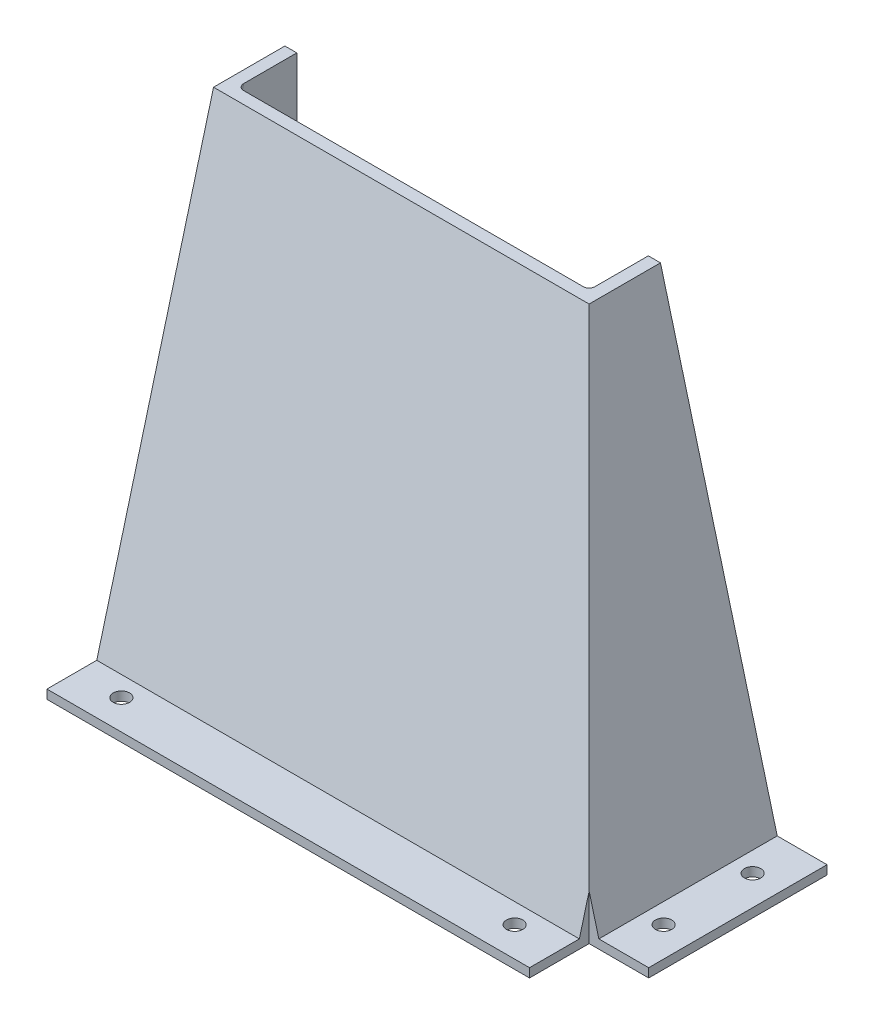
ISO-10303-21;
HEADER;
FILE_DESCRIPTION(('STEP AP214'),'2;1');
FILE_NAME('part.step','',(''),(''),'','','');
FILE_SCHEMA(('AUTOMOTIVE_DESIGN { 1 0 10303 214 1 1 1 1 }'));
ENDSEC;
DATA;
#1=APPLICATION_CONTEXT('core data for automotive mechanical design processes');
#2=APPLICATION_PROTOCOL_DEFINITION('international standard','automotive_design',2000,#1);
#3=PRODUCT_CONTEXT('',#1,'mechanical');
#4=PRODUCT('Part','Part','',(#3));
#5=PRODUCT_RELATED_PRODUCT_CATEGORY('part','',(#4));
#6=PRODUCT_DEFINITION_FORMATION('','',#4);
#7=PRODUCT_DEFINITION_CONTEXT('part definition',#1,'design');
#8=PRODUCT_DEFINITION('design','',#6,#7);
#9=PRODUCT_DEFINITION_SHAPE('','',#8);
#10=(LENGTH_UNIT() NAMED_UNIT(*) SI_UNIT(.MILLI.,.METRE.));
#11=(NAMED_UNIT(*) PLANE_ANGLE_UNIT() SI_UNIT($,.RADIAN.));
#12=(NAMED_UNIT(*) SI_UNIT($,.STERADIAN.) SOLID_ANGLE_UNIT());
#13=UNCERTAINTY_MEASURE_WITH_UNIT(LENGTH_MEASURE(1.E-05),#10,'distance_accuracy_value','');
#14=(GEOMETRIC_REPRESENTATION_CONTEXT(3) GLOBAL_UNCERTAINTY_ASSIGNED_CONTEXT((#13)) GLOBAL_UNIT_ASSIGNED_CONTEXT((#10,
#11,#12)) REPRESENTATION_CONTEXT('',''));
#15=CARTESIAN_POINT('',(0.,0.,0.));
#16=DIRECTION('',(0.,0.,1.));
#17=DIRECTION('',(1.,0.,0.));
#18=AXIS2_PLACEMENT_3D('',#15,#16,#17);
#19=CARTESIAN_POINT('',(77.9651100404987,150.0011,48.9051100404986));
#20=DIRECTION('',(-1.,0.,0.));
#21=DIRECTION('',(0.,0.,1.));
#22=AXIS2_PLACEMENT_3D('',#19,#20,#21);
#23=PLANE('',#22);
#24=DIRECTION('',(0.,-1.,0.));
#25=VECTOR('',#24,1.);
#26=CARTESIAN_POINT('',(77.9651100404987,150.0011,28.9051100404986));
#27=LINE('',#26,#25);
#28=CARTESIAN_POINT('',(77.9651100404987,15.26208734813,28.9051100404986));
#29=VERTEX_POINT('',#28);
#30=CARTESIAN_POINT('',(77.9651100404987,0.,28.9051100404986));
#31=VERTEX_POINT('',#30);
#32=EDGE_CURVE('E182',#29,#31,#27,.T.);
#33=ORIENTED_EDGE('',*,*,#32,.F.);
#34=DIRECTION('',(0.,0.966234939601246,-0.257662650560332));
#35=VECTOR('',#34,1.);
#36=CARTESIAN_POINT('',(77.9651100404985,140.241690871369,-4.42278423236517));
#37=LINE('',#36,#35);
#38=CARTESIAN_POINT('',(77.9651100404987,3.,32.175));
#39=VERTEX_POINT('',#38);
#40=EDGE_CURVE('E176',#39,#29,#37,.T.);
#41=ORIENTED_EDGE('',*,*,#40,.F.);
#42=DIRECTION('',(0.,0.,-1.));
#43=VECTOR('',#42,1.);
#44=CARTESIAN_POINT('',(77.9651100404987,3.,48.9051100404986));
#45=LINE('',#44,#43);
#46=CARTESIAN_POINT('',(77.9651100404987,3.,48.9051100404986));
#47=VERTEX_POINT('',#46);
#48=EDGE_CURVE('E179',#47,#39,#45,.T.);
#49=ORIENTED_EDGE('',*,*,#48,.F.);
#50=DIRECTION('',(0.,-1.,0.));
#51=VECTOR('',#50,1.);
#52=CARTESIAN_POINT('',(77.9651100404987,150.0011,48.9051100404986));
#53=LINE('',#52,#51);
#54=CARTESIAN_POINT('',(77.9651100404987,0.,48.9051100404986));
#55=VERTEX_POINT('',#54);
#56=EDGE_CURVE('E228',#47,#55,#53,.T.);
#57=ORIENTED_EDGE('',*,*,#56,.T.);
#58=DIRECTION('',(0.,0.,-1.));
#59=VECTOR('',#58,1.);
#60=CARTESIAN_POINT('',(77.9651100404987,0.,48.9051100404986));
#61=LINE('',#60,#59);
#62=EDGE_CURVE('E214',#55,#31,#61,.T.);
#63=ORIENTED_EDGE('',*,*,#62,.T.);
#64=EDGE_LOOP('',(#33,#41,#49,#57,#63));
#65=FACE_BOUND('',#64,.T.);
#66=ADVANCED_FACE('F49',(#65),#23,.F.);
#67=CARTESIAN_POINT('',(97.9651100404987,150.0011,28.9051100404987));
#68=DIRECTION('',(0.,0.,-1.));
#69=DIRECTION('',(-1.,0.,0.));
#70=AXIS2_PLACEMENT_3D('',#67,#68,#69);
#71=PLANE('',#70);
#72=DIRECTION('',(1.,0.,0.));
#73=VECTOR('',#72,1.);
#74=CARTESIAN_POINT('',(97.9651100404987,3.,28.9051100404987));
#75=LINE('',#74,#73);
#76=CARTESIAN_POINT('',(81.235,3.,28.9051100404986));
#77=VERTEX_POINT('',#76);
#78=CARTESIAN_POINT('',(97.9651100404987,3.,28.9051100404987));
#79=VERTEX_POINT('',#78);
#80=EDGE_CURVE('E209',#77,#79,#75,.T.);
#81=ORIENTED_EDGE('',*,*,#80,.F.);
#82=DIRECTION('',(0.257662650560332,-0.966234939601246,0.));
#83=VECTOR('',#82,1.);
#84=CARTESIAN_POINT('',(44.4201276375435,141.055771359212,28.9051100404987));
#85=LINE('',#84,#83);
#86=EDGE_CURVE('E189',#29,#77,#85,.T.);
#87=ORIENTED_EDGE('',*,*,#86,.F.);
#88=ORIENTED_EDGE('',*,*,#32,.T.);
#89=DIRECTION('',(1.,0.,0.));
#90=VECTOR('',#89,1.);
#91=CARTESIAN_POINT('',(97.9651100404987,0.,28.9051100404987));
#92=LINE('',#91,#90);
#93=CARTESIAN_POINT('',(97.9651100404987,0.,28.9051100404986));
#94=VERTEX_POINT('',#93);
#95=EDGE_CURVE('E225',#31,#94,#92,.T.);
#96=ORIENTED_EDGE('',*,*,#95,.T.);
#97=DIRECTION('',(0.,-1.,0.));
#98=VECTOR('',#97,1.);
#99=CARTESIAN_POINT('',(97.9651100404987,150.0011,28.9051100404987));
#100=LINE('',#99,#98);
#101=EDGE_CURVE('E229',#79,#94,#100,.T.);
#102=ORIENTED_EDGE('',*,*,#101,.F.);
#103=EDGE_LOOP('',(#81,#87,#88,#96,#102));
#104=FACE_BOUND('',#103,.T.);
#105=ADVANCED_FACE('F362',(#104),#71,.F.);
#106=CARTESIAN_POINT('',(0.,0.,0.));
#107=DIRECTION('',(0.,1.,0.));
#108=DIRECTION('',(0.,0.,1.));
#109=AXIS2_PLACEMENT_3D('',#106,#107,#108);
#110=PLANE('',#109);
#111=CARTESIAN_POINT('',(87.9651100404987,0.,-15.975));
#112=DIRECTION('',(0.,-1.,0.));
#113=DIRECTION('',(0.,0.,-1.));
#114=AXIS2_PLACEMENT_3D('',#111,#112,#113);
#115=CIRCLE('',#114,2.75000000000001);
#116=CARTESIAN_POINT('',(87.9651100404987,0.,-18.725));
#117=VERTEX_POINT('',#116);
#118=EDGE_CURVE('E280',#117,#117,#115,.T.);
#119=ORIENTED_EDGE('',*,*,#118,.F.);
#120=EDGE_LOOP('',(#119));
#121=FACE_BOUND('',#120,.T.);
#122=CARTESIAN_POINT('',(87.9651100404987,0.,13.9051100404987));
#123=DIRECTION('',(0.,-1.,0.));
#124=DIRECTION('',(0.,0.,-1.));
#125=AXIS2_PLACEMENT_3D('',#122,#123,#124);
#126=CIRCLE('',#125,2.75000000000001);
#127=CARTESIAN_POINT('',(87.9651100404987,0.,11.1551100404986));
#128=VERTEX_POINT('',#127);
#129=EDGE_CURVE('E328',#128,#128,#126,.T.);
#130=ORIENTED_EDGE('',*,*,#129,.F.);
#131=EDGE_LOOP('',(#130));
#132=FACE_BOUND('',#131,.T.);
#133=CARTESIAN_POINT('',(62.9651100404987,0.,38.9051100404986));
#134=DIRECTION('',(0.,-1.,0.));
#135=DIRECTION('',(0.,0.,-1.));
#136=AXIS2_PLACEMENT_3D('',#133,#134,#135);
#137=CIRCLE('',#136,2.75000000000001);
#138=CARTESIAN_POINT('',(62.9651100404987,0.,36.1551100404986));
#139=VERTEX_POINT('',#138);
#140=EDGE_CURVE('E322',#139,#139,#137,.T.);
#141=ORIENTED_EDGE('',*,*,#140,.F.);
#142=EDGE_LOOP('',(#141));
#143=FACE_BOUND('',#142,.T.);
#144=CARTESIAN_POINT('',(-69.035,0.,38.9051100404986));
#145=DIRECTION('',(0.,-1.,0.));
#146=DIRECTION('',(0.,0.,-1.));
#147=AXIS2_PLACEMENT_3D('',#144,#145,#146);
#148=CIRCLE('',#147,2.75000000000001);
#149=CARTESIAN_POINT('',(-69.035,0.,36.1551100404986));
#150=VERTEX_POINT('',#149);
#151=EDGE_CURVE('E315',#150,#150,#148,.T.);
#152=ORIENTED_EDGE('',*,*,#151,.F.);
#153=EDGE_LOOP('',(#152));
#154=FACE_BOUND('',#153,.T.);
#155=DIRECTION('',(0.,0.,1.));
#156=VECTOR('',#155,1.);
#157=CARTESIAN_POINT('',(-80.035,0.,28.9051100404986));
#158=LINE('',#157,#156);
#159=CARTESIAN_POINT('',(-80.035,0.,-30.975));
#160=VERTEX_POINT('',#159);
#161=CARTESIAN_POINT('',(-80.035,0.,26.8352200809973));
#162=VERTEX_POINT('',#161);
#163=EDGE_CURVE('E220',#160,#162,#158,.T.);
#164=ORIENTED_EDGE('',*,*,#163,.T.);
#165=CARTESIAN_POINT('',(-78.035,0.,26.8352200809973));
#166=DIRECTION('',(0.,1.,0.));
#167=DIRECTION('',(0.,0.,-1.));
#168=AXIS2_PLACEMENT_3D('',#165,#166,#167);
#169=ELLIPSE('',#168,2.06988995950134,2.);
#170=CARTESIAN_POINT('',(-78.035,0.,28.9051100404986));
#171=VERTEX_POINT('',#170);
#172=EDGE_CURVE('E60',#162,#171,#169,.T.);
#173=ORIENTED_EDGE('',*,*,#172,.T.);
#174=DIRECTION('',(1.,0.,0.));
#175=VECTOR('',#174,1.);
#176=CARTESIAN_POINT('',(0.,0.,28.9051100404986));
#177=LINE('',#176,#175);
#178=CARTESIAN_POINT('',(76.0326401612962,0.,28.9051100404986));
#179=VERTEX_POINT('',#178);
#180=EDGE_CURVE('E265',#171,#179,#177,.T.);
#181=ORIENTED_EDGE('',*,*,#180,.T.);
#182=CARTESIAN_POINT('',(75.8952200809973,0.,26.8352200809973));
#183=DIRECTION('',(0.,1.,0.));
#184=DIRECTION('',(-0.707106781186548,0.,-0.707106781186548));
#185=AXIS2_PLACEMENT_3D('',#182,#183,#184);
#186=ELLIPSE('',#185,2.13749593891752,2.);
#187=CARTESIAN_POINT('',(77.9651100404987,0.,26.9726401612962));
#188=VERTEX_POINT('',#187);
#189=EDGE_CURVE('E439',#179,#188,#186,.T.);
#190=ORIENTED_EDGE('',*,*,#189,.T.);
#191=DIRECTION('',(0.,0.,-1.));
#192=VECTOR('',#191,1.);
#193=CARTESIAN_POINT('',(77.9651100404987,0.,0.));
#194=LINE('',#193,#192);
#195=CARTESIAN_POINT('',(77.9651100404987,0.,-30.975));
#196=VERTEX_POINT('',#195);
#197=EDGE_CURVE('E71',#188,#196,#194,.T.);
#198=ORIENTED_EDGE('',*,*,#197,.T.);
#199=DIRECTION('',(-1.,0.,0.));
#200=VECTOR('',#199,1.);
#201=CARTESIAN_POINT('',(-80.035,0.,-30.975));
#202=LINE('',#201,#200);
#203=CARTESIAN_POINT('',(97.9651100404987,0.,-30.975));
#204=VERTEX_POINT('',#203);
#205=EDGE_CURVE('E375',#204,#196,#202,.T.);
#206=ORIENTED_EDGE('',*,*,#205,.F.);
#207=DIRECTION('',(0.,0.,-1.));
#208=VECTOR('',#207,1.);
#209=CARTESIAN_POINT('',(97.9651100404987,0.,69.1288584566553));
#210=LINE('',#209,#208);
#211=EDGE_CURVE('E244',#94,#204,#210,.T.);
#212=ORIENTED_EDGE('',*,*,#211,.F.);
#213=ORIENTED_EDGE('',*,*,#95,.F.);
#214=ORIENTED_EDGE('',*,*,#62,.F.);
#215=DIRECTION('',(-1.,0.,0.));
#216=VECTOR('',#215,1.);
#217=CARTESIAN_POINT('',(100.212107655599,0.,48.9051100404986));
#218=LINE('',#217,#216);
#219=CARTESIAN_POINT('',(-84.035,0.,48.9051100404986));
#220=VERTEX_POINT('',#219);
#221=EDGE_CURVE('E247',#55,#220,#218,.T.);
#222=ORIENTED_EDGE('',*,*,#221,.T.);
#223=DIRECTION('',(0.,0.,1.));
#224=VECTOR('',#223,1.);
#225=CARTESIAN_POINT('',(-84.035,0.,28.9051100404986));
#226=LINE('',#225,#224);
#227=CARTESIAN_POINT('',(-84.035,0.,-30.975));
#228=VERTEX_POINT('',#227);
#229=EDGE_CURVE('E285',#228,#220,#226,.T.);
#230=ORIENTED_EDGE('',*,*,#229,.F.);
#231=DIRECTION('',(1.,0.,0.));
#232=VECTOR('',#231,1.);
#233=CARTESIAN_POINT('',(-84.035,0.,-30.975));
#234=LINE('',#233,#232);
#235=EDGE_CURVE('E217',#228,#160,#234,.T.);
#236=ORIENTED_EDGE('',*,*,#235,.T.);
#237=EDGE_LOOP('',(#164,#173,#181,#190,#198,#206,#212,#213,#214,#222,#230,#236));
#238=FACE_BOUND('',#237,.T.);
#239=ADVANCED_FACE('F385',(#121,#132,#143,#154,#238),#110,.F.);
#240=CARTESIAN_POINT('',(100.212107655599,3.,28.9051100404986));
#241=DIRECTION('',(0.,1.,0.));
#242=DIRECTION('',(0.,0.,1.));
#243=AXIS2_PLACEMENT_3D('',#240,#241,#242);
#244=PLANE('',#243);
#245=DIRECTION('',(-1.,0.,0.));
#246=VECTOR('',#245,1.);
#247=CARTESIAN_POINT('',(214.966897072176,3.,32.175));
#248=LINE('',#247,#246);
#249=CARTESIAN_POINT('',(-84.035,3.,32.175));
#250=VERTEX_POINT('',#249);
#251=EDGE_CURVE('E192',#39,#250,#248,.T.);
#252=ORIENTED_EDGE('',*,*,#251,.T.);
#253=DIRECTION('',(0.,0.,-1.));
#254=VECTOR('',#253,1.);
#255=CARTESIAN_POINT('',(-84.035,3.,48.9051100404986));
#256=LINE('',#255,#254);
#257=CARTESIAN_POINT('',(-84.035,3.,48.9051100404986));
#258=VERTEX_POINT('',#257);
#259=EDGE_CURVE('E307',#258,#250,#256,.T.);
#260=ORIENTED_EDGE('',*,*,#259,.F.);
#261=DIRECTION('',(-1.,0.,0.));
#262=VECTOR('',#261,1.);
#263=CARTESIAN_POINT('',(100.212107655599,3.,48.9051100404986));
#264=LINE('',#263,#262);
#265=EDGE_CURVE('E207',#47,#258,#264,.T.);
#266=ORIENTED_EDGE('',*,*,#265,.F.);
#267=ORIENTED_EDGE('',*,*,#48,.T.);
#268=EDGE_LOOP('',(#252,#260,#266,#267));
#269=FACE_BOUND('',#268,.T.);
#270=CARTESIAN_POINT('',(62.9651100404987,3.,38.9051100404986));
#271=DIRECTION('',(0.,1.,0.));
#272=DIRECTION('',(0.,0.,1.));
#273=AXIS2_PLACEMENT_3D('',#270,#271,#272);
#274=CIRCLE('',#273,2.75000000000001);
#275=CARTESIAN_POINT('',(62.9651100404987,3.,41.6551100404987));
#276=VERTEX_POINT('',#275);
#277=EDGE_CURVE('E318',#276,#276,#274,.F.);
#278=ORIENTED_EDGE('',*,*,#277,.T.);
#279=EDGE_LOOP('',(#278));
#280=FACE_BOUND('',#279,.T.);
#281=CARTESIAN_POINT('',(-69.035,3.,38.9051100404986));
#282=DIRECTION('',(0.,1.,0.));
#283=DIRECTION('',(0.,0.,1.));
#284=AXIS2_PLACEMENT_3D('',#281,#282,#283);
#285=CIRCLE('',#284,2.75000000000001);
#286=CARTESIAN_POINT('',(-69.035,3.,41.6551100404987));
#287=VERTEX_POINT('',#286);
#288=EDGE_CURVE('E201',#287,#287,#285,.F.);
#289=ORIENTED_EDGE('',*,*,#288,.T.);
#290=EDGE_LOOP('',(#289));
#291=FACE_BOUND('',#290,.T.);
#292=ADVANCED_FACE('F205',(#269,#280,#291),#244,.T.);
#293=CARTESIAN_POINT('',(0.,150.,0.));
#294=DIRECTION('',(0.,-1.,0.));
#295=DIRECTION('',(0.,0.,-1.));
#296=AXIS2_PLACEMENT_3D('',#293,#294,#295);
#297=PLANE('',#296);
#298=DIRECTION('',(1.,0.,0.));
#299=VECTOR('',#298,1.);
#300=CARTESIAN_POINT('',(0.,150.,-11.0948899595014));
#301=LINE('',#300,#299);
#302=CARTESIAN_POINT('',(-78.035,150.,-11.0948899595014));
#303=VERTEX_POINT('',#302);
#304=CARTESIAN_POINT('',(36.0326401612962,150.,-11.0948899595014));
#305=VERTEX_POINT('',#304);
#306=EDGE_CURVE('E260',#303,#305,#301,.T.);
#307=ORIENTED_EDGE('',*,*,#306,.F.);
#308=CARTESIAN_POINT('',(-78.035,150.,-13.1647799190027));
#309=DIRECTION('',(0.,-1.,0.));
#310=DIRECTION('',(0.,0.,-1.));
#311=AXIS2_PLACEMENT_3D('',#308,#309,#310);
#312=ELLIPSE('',#311,2.06988995950134,2.);
#313=CARTESIAN_POINT('',(-80.035,150.,-13.1647799190027));
#314=VERTEX_POINT('',#313);
#315=EDGE_CURVE('E79',#303,#314,#312,.T.);
#316=ORIENTED_EDGE('',*,*,#315,.T.);
#317=DIRECTION('',(0.,0.,-1.));
#318=VECTOR('',#317,1.);
#319=CARTESIAN_POINT('',(-80.035,150.,-30.975));
#320=LINE('',#319,#318);
#321=CARTESIAN_POINT('',(-80.035,150.,-30.975));
#322=VERTEX_POINT('',#321);
#323=EDGE_CURVE('E276',#314,#322,#320,.T.);
#324=ORIENTED_EDGE('',*,*,#323,.T.);
#325=DIRECTION('',(1.,0.,0.));
#326=VECTOR('',#325,1.);
#327=CARTESIAN_POINT('',(-84.035,150.,-30.975));
#328=LINE('',#327,#326);
#329=CARTESIAN_POINT('',(-84.035,150.,-30.975));
#330=VERTEX_POINT('',#329);
#331=EDGE_CURVE('E210',#330,#322,#328,.T.);
#332=ORIENTED_EDGE('',*,*,#331,.F.);
#333=DIRECTION('',(0.,0.,-1.));
#334=VECTOR('',#333,1.);
#335=CARTESIAN_POINT('',(-84.035,150.,-9.02500000000001));
#336=LINE('',#335,#334);
#337=CARTESIAN_POINT('',(-84.035,150.,-7.02500000000002));
#338=VERTEX_POINT('',#337);
#339=EDGE_CURVE('E304',#338,#330,#336,.T.);
#340=ORIENTED_EDGE('',*,*,#339,.F.);
#341=DIRECTION('',(-1.,0.,0.));
#342=VECTOR('',#341,1.);
#343=CARTESIAN_POINT('',(214.966897072176,150.,-7.02500000000002));
#344=LINE('',#343,#342);
#345=CARTESIAN_POINT('',(42.035,150.,-7.02500000000003));
#346=VERTEX_POINT('',#345);
#347=EDGE_CURVE('E202',#346,#338,#344,.T.);
#348=ORIENTED_EDGE('',*,*,#347,.F.);
#349=DIRECTION('',(0.,0.,-1.));
#350=VECTOR('',#349,1.);
#351=CARTESIAN_POINT('',(42.035,150.,167.906897072176));
#352=LINE('',#351,#350);
#353=CARTESIAN_POINT('',(42.035,150.,-30.975));
#354=VERTEX_POINT('',#353);
#355=EDGE_CURVE('E341',#346,#354,#352,.T.);
#356=ORIENTED_EDGE('',*,*,#355,.T.);
#357=DIRECTION('',(1.,0.,0.));
#358=VECTOR('',#357,1.);
#359=CARTESIAN_POINT('',(42.035,150.,-30.975));
#360=LINE('',#359,#358);
#361=CARTESIAN_POINT('',(40.035,150.,-30.975));
#362=VERTEX_POINT('',#361);
#363=EDGE_CURVE('E188',#362,#354,#360,.T.);
#364=ORIENTED_EDGE('',*,*,#363,.F.);
#365=DIRECTION('',(1.,0.,0.));
#366=VECTOR('',#365,1.);
#367=CARTESIAN_POINT('',(-80.035,150.,-30.975));
#368=LINE('',#367,#366);
#369=CARTESIAN_POINT('',(37.9651100404987,150.,-30.975));
#370=VERTEX_POINT('',#369);
#371=EDGE_CURVE('E53',#370,#362,#368,.T.);
#372=ORIENTED_EDGE('',*,*,#371,.F.);
#373=DIRECTION('',(0.,0.,1.));
#374=VECTOR('',#373,1.);
#375=CARTESIAN_POINT('',(37.9651100404987,150.,0.));
#376=LINE('',#375,#374);
#377=CARTESIAN_POINT('',(37.9651100404987,150.,-13.0273598387038));
#378=VERTEX_POINT('',#377);
#379=EDGE_CURVE('E257',#370,#378,#376,.T.);
#380=ORIENTED_EDGE('',*,*,#379,.T.);
#381=CARTESIAN_POINT('',(35.8952200809973,150.,-13.1647799190027));
#382=DIRECTION('',(0.,-1.,0.));
#383=DIRECTION('',(-0.707106781186548,0.,-0.707106781186548));
#384=AXIS2_PLACEMENT_3D('',#381,#382,#383);
#385=ELLIPSE('',#384,2.13749593891752,2.);
#386=EDGE_CURVE('E428',#378,#305,#385,.T.);
#387=ORIENTED_EDGE('',*,*,#386,.T.);
#388=EDGE_LOOP('',(#307,#316,#324,#332,#340,#348,#356,#364,#372,#380,#387));
#389=FACE_BOUND('',#388,.T.);
#390=ADVANCED_FACE('F377',(#389),#297,.F.);
#391=CARTESIAN_POINT('',(0.,0.,-30.975));
#392=DIRECTION('',(0.,0.,-1.));
#393=DIRECTION('',(-1.,0.,0.));
#394=AXIS2_PLACEMENT_3D('',#391,#392,#393);
#395=PLANE('',#394);
#396=ORIENTED_EDGE('',*,*,#371,.T.);
#397=ORIENTED_EDGE('',*,*,#363,.T.);
#398=DIRECTION('',(0.257662650560332,-0.966234939601246,0.));
#399=VECTOR('',#398,1.);
#400=CARTESIAN_POINT('',(81.235,3.,-30.975));
#401=LINE('',#400,#399);
#402=CARTESIAN_POINT('',(81.235,3.,-30.975));
#403=VERTEX_POINT('',#402);
#404=EDGE_CURVE('E343',#354,#403,#401,.T.);
#405=ORIENTED_EDGE('',*,*,#404,.T.);
#406=DIRECTION('',(1.,0.,0.));
#407=VECTOR('',#406,1.);
#408=CARTESIAN_POINT('',(77.9651100404987,3.,-30.975));
#409=LINE('',#408,#407);
#410=CARTESIAN_POINT('',(97.9651100404987,3.,-30.975));
#411=VERTEX_POINT('',#410);
#412=EDGE_CURVE('E232',#403,#411,#409,.T.);
#413=ORIENTED_EDGE('',*,*,#412,.T.);
#414=DIRECTION('',(0.,-1.,0.));
#415=VECTOR('',#414,1.);
#416=CARTESIAN_POINT('',(97.9651100404987,0.,-30.975));
#417=LINE('',#416,#415);
#418=EDGE_CURVE('E237',#411,#204,#417,.T.);
#419=ORIENTED_EDGE('',*,*,#418,.T.);
#420=ORIENTED_EDGE('',*,*,#205,.T.);
#421=DIRECTION('',(-0.257662650560332,0.966234939601246,0.));
#422=VECTOR('',#421,1.);
#423=CARTESIAN_POINT('',(72.7890031498432,19.4104008399582,-30.975));
#424=LINE('',#423,#422);
#425=EDGE_CURVE('E264',#196,#370,#424,.T.);
#426=ORIENTED_EDGE('',*,*,#425,.T.);
#427=EDGE_LOOP('',(#396,#397,#405,#413,#419,#420,#426));
#428=FACE_BOUND('',#427,.T.);
#429=ADVANCED_FACE('F373',(#428),#395,.T.);
#430=CARTESIAN_POINT('',(0.,7.19629295614074,26.9860985855278));
#431=DIRECTION('',(0.,-0.257662650560332,-0.966234939601246));
#432=DIRECTION('',(0.,0.966234939601246,-0.257662650560332));
#433=AXIS2_PLACEMENT_3D('',#430,#431,#432);
#434=PLANE('',#433);
#435=ORIENTED_EDGE('',*,*,#306,.T.);
#436=DIRECTION('',(-0.249513144620722,0.935674292327708,-0.249513144620722));
#437=VECTOR('',#436,1.);
#438=CARTESIAN_POINT('',(69.4995506545697,24.4990856502245,22.3720205337721));
#439=LINE('',#438,#437);
#440=EDGE_CURVE('E271',#305,#179,#439,.F.);
#441=ORIENTED_EDGE('',*,*,#440,.T.);
#442=ORIENTED_EDGE('',*,*,#180,.F.);
#443=DIRECTION('',(0.,0.966234939601246,-0.257662650560332));
#444=VECTOR('',#443,1.);
#445=CARTESIAN_POINT('',(-78.035,7.19629295614074,26.9860985855278));
#446=LINE('',#445,#444);
#447=EDGE_CURVE('E268',#171,#303,#446,.T.);
#448=ORIENTED_EDGE('',*,*,#447,.T.);
#449=EDGE_LOOP('',(#435,#441,#442,#448));
#450=FACE_BOUND('',#449,.T.);
#451=ADVANCED_FACE('F416',(#450),#434,.T.);
#452=CARTESIAN_POINT('',(72.7890031498432,19.4104008399582,0.));
#453=DIRECTION('',(0.966234939601246,0.257662650560332,0.));
#454=DIRECTION('',(-0.257662650560332,0.966234939601246,0.));
#455=AXIS2_PLACEMENT_3D('',#452,#453,#454);
#456=PLANE('',#455);
#457=ORIENTED_EDGE('',*,*,#197,.F.);
#458=DIRECTION('',(-0.249513144620722,0.935674292327708,-0.249513144620722));
#459=VECTOR('',#458,1.);
#460=CARTESIAN_POINT('',(71.4320205337721,24.4990856502245,20.4395506545696));
#461=LINE('',#460,#459);
#462=EDGE_CURVE('E272',#188,#378,#461,.T.);
#463=ORIENTED_EDGE('',*,*,#462,.T.);
#464=ORIENTED_EDGE('',*,*,#379,.F.);
#465=ORIENTED_EDGE('',*,*,#425,.F.);
#466=EDGE_LOOP('',(#457,#463,#464,#465));
#467=FACE_BOUND('',#466,.T.);
#468=ADVANCED_FACE('F429',(#467),#456,.F.);
#469=DIRECTION('',(0.,0.,-1.));
#470=VECTOR('',#469,1.);
#471=CARTESIAN_POINT('',(81.235,3.,28.9051100404986));
#472=LINE('',#471,#470);
#473=EDGE_CURVE('E12',#77,#403,#472,.T.);
#474=ORIENTED_EDGE('',*,*,#473,.F.);
#475=ORIENTED_EDGE('',*,*,#80,.T.);
#476=DIRECTION('',(0.,0.,-1.));
#477=VECTOR('',#476,1.);
#478=CARTESIAN_POINT('',(97.9651100404987,3.,69.1288584566553));
#479=LINE('',#478,#477);
#480=EDGE_CURVE('E241',#79,#411,#479,.T.);
#481=ORIENTED_EDGE('',*,*,#480,.T.);
#482=ORIENTED_EDGE('',*,*,#412,.F.);
#483=EDGE_LOOP('',(#474,#475,#481,#482));
#484=FACE_BOUND('',#483,.T.);
#485=CARTESIAN_POINT('',(87.9651100404987,3.,-15.975));
#486=DIRECTION('',(0.,1.,0.));
#487=DIRECTION('',(0.,0.,1.));
#488=AXIS2_PLACEMENT_3D('',#485,#486,#487);
#489=CIRCLE('',#488,2.75000000000001);
#490=CARTESIAN_POINT('',(87.9651100404987,3.,-13.225));
#491=VERTEX_POINT('',#490);
#492=EDGE_CURVE('E331',#491,#491,#489,.F.);
#493=ORIENTED_EDGE('',*,*,#492,.T.);
#494=EDGE_LOOP('',(#493));
#495=FACE_BOUND('',#494,.T.);
#496=CARTESIAN_POINT('',(87.9651100404987,3.,13.9051100404987));
#497=DIRECTION('',(0.,1.,0.));
#498=DIRECTION('',(0.,0.,1.));
#499=AXIS2_PLACEMENT_3D('',#496,#497,#498);
#500=CIRCLE('',#499,2.75000000000001);
#501=CARTESIAN_POINT('',(87.9651100404987,3.,16.6551100404987));
#502=VERTEX_POINT('',#501);
#503=EDGE_CURVE('E325',#502,#502,#500,.F.);
#504=ORIENTED_EDGE('',*,*,#503,.T.);
#505=EDGE_LOOP('',(#504));
#506=FACE_BOUND('',#505,.T.);
#507=ADVANCED_FACE('F359',(#484,#495,#506),#244,.T.);
#508=CARTESIAN_POINT('',(100.212107655599,0.,48.9051100404986));
#509=DIRECTION('',(0.,0.,1.));
#510=DIRECTION('',(1.,0.,0.));
#511=AXIS2_PLACEMENT_3D('',#508,#509,#510);
#512=PLANE('',#511);
#513=ORIENTED_EDGE('',*,*,#56,.F.);
#514=ORIENTED_EDGE('',*,*,#265,.T.);
#515=DIRECTION('',(0.,1.,0.));
#516=VECTOR('',#515,1.);
#517=CARTESIAN_POINT('',(-84.035,0.,48.9051100404986));
#518=LINE('',#517,#516);
#519=EDGE_CURVE('E311',#220,#258,#518,.T.);
#520=ORIENTED_EDGE('',*,*,#519,.F.);
#521=ORIENTED_EDGE('',*,*,#221,.F.);
#522=EDGE_LOOP('',(#513,#514,#520,#521));
#523=FACE_BOUND('',#522,.T.);
#524=ADVANCED_FACE('F383',(#523),#512,.T.);
#525=CARTESIAN_POINT('',(97.9651100404987,0.,69.1288584566553));
#526=DIRECTION('',(1.,0.,0.));
#527=DIRECTION('',(0.,0.,-1.));
#528=AXIS2_PLACEMENT_3D('',#525,#526,#527);
#529=PLANE('',#528);
#530=ORIENTED_EDGE('',*,*,#101,.T.);
#531=ORIENTED_EDGE('',*,*,#211,.T.);
#532=ORIENTED_EDGE('',*,*,#418,.F.);
#533=ORIENTED_EDGE('',*,*,#480,.F.);
#534=EDGE_LOOP('',(#530,#531,#532,#533));
#535=FACE_BOUND('',#534,.T.);
#536=ADVANCED_FACE('F368',(#535),#529,.T.);
#537=CARTESIAN_POINT('',(-84.035,0.,-30.975));
#538=DIRECTION('',(0.,0.,1.));
#539=DIRECTION('',(1.,0.,0.));
#540=AXIS2_PLACEMENT_3D('',#537,#538,#539);
#541=PLANE('',#540);
#542=DIRECTION('',(0.,-1.,0.));
#543=VECTOR('',#542,1.);
#544=CARTESIAN_POINT('',(-80.035,0.,-30.975));
#545=LINE('',#544,#543);
#546=EDGE_CURVE('E279',#322,#160,#545,.T.);
#547=ORIENTED_EDGE('',*,*,#546,.T.);
#548=ORIENTED_EDGE('',*,*,#235,.F.);
#549=DIRECTION('',(0.,-1.,0.));
#550=VECTOR('',#549,1.);
#551=CARTESIAN_POINT('',(-84.035,0.,-30.975));
#552=LINE('',#551,#550);
#553=EDGE_CURVE('E298',#330,#228,#552,.T.);
#554=ORIENTED_EDGE('',*,*,#553,.F.);
#555=ORIENTED_EDGE('',*,*,#331,.T.);
#556=EDGE_LOOP('',(#547,#548,#554,#555));
#557=FACE_BOUND('',#556,.T.);
#558=ADVANCED_FACE('F470',(#557),#541,.F.);
#559=CARTESIAN_POINT('',(-84.035,0.,0.));
#560=DIRECTION('',(-1.,0.,0.));
#561=DIRECTION('',(0.,0.,1.));
#562=AXIS2_PLACEMENT_3D('',#559,#560,#561);
#563=PLANE('',#562);
#564=DIRECTION('',(0.,0.966234939601246,-0.257662650560332));
#565=VECTOR('',#564,1.);
#566=CARTESIAN_POINT('',(-84.035,3.,32.175));
#567=LINE('',#566,#565);
#568=EDGE_CURVE('E196',#250,#338,#567,.T.);
#569=ORIENTED_EDGE('',*,*,#568,.T.);
#570=ORIENTED_EDGE('',*,*,#339,.T.);
#571=ORIENTED_EDGE('',*,*,#553,.T.);
#572=ORIENTED_EDGE('',*,*,#229,.T.);
#573=ORIENTED_EDGE('',*,*,#519,.T.);
#574=ORIENTED_EDGE('',*,*,#259,.T.);
#575=EDGE_LOOP('',(#569,#570,#571,#572,#573,#574));
#576=FACE_BOUND('',#575,.T.);
#577=ADVANCED_FACE('F380',(#576),#563,.T.);
#578=CARTESIAN_POINT('',(-80.035,0.,0.));
#579=DIRECTION('',(-1.,0.,0.));
#580=DIRECTION('',(0.,0.,1.));
#581=AXIS2_PLACEMENT_3D('',#578,#579,#580);
#582=PLANE('',#581);
#583=ORIENTED_EDGE('',*,*,#323,.F.);
#584=DIRECTION('',(0.,0.966234939601246,-0.257662650560332));
#585=VECTOR('',#584,1.);
#586=CARTESIAN_POINT('',(-80.035,6.68096765502008,25.0536287063253));
#587=LINE('',#586,#585);
#588=EDGE_CURVE('E275',#314,#162,#587,.F.);
#589=ORIENTED_EDGE('',*,*,#588,.T.);
#590=ORIENTED_EDGE('',*,*,#163,.F.);
#591=ORIENTED_EDGE('',*,*,#546,.F.);
#592=EDGE_LOOP('',(#583,#589,#590,#591));
#593=FACE_BOUND('',#592,.T.);
#594=ADVANCED_FACE('F451',(#593),#582,.F.);
#595=CARTESIAN_POINT('',(69.4995506545697,23.9837603491038,20.4395506545696));
#596=DIRECTION('',(-0.249513144620722,0.935674292327708,-0.249513144620722));
#597=DIRECTION('',(0.,0.257662650560332,0.966234939601246));
#598=AXIS2_PLACEMENT_3D('',#595,#596,#597);
#599=CYLINDRICAL_SURFACE('',#598,2.);
#600=ORIENTED_EDGE('',*,*,#189,.F.);
#601=ORIENTED_EDGE('',*,*,#440,.F.);
#602=ORIENTED_EDGE('',*,*,#386,.F.);
#603=ORIENTED_EDGE('',*,*,#462,.F.);
#604=EDGE_LOOP('',(#600,#601,#602,#603));
#605=FACE_BOUND('',#604,.T.);
#606=ADVANCED_FACE('F420',(#605),#599,.F.);
#607=CARTESIAN_POINT('',(-78.035,6.68096765502008,25.0536287063253));
#608=DIRECTION('',(0.,0.966234939601246,-0.257662650560332));
#609=DIRECTION('',(0.,0.257662650560332,0.966234939601246));
#610=AXIS2_PLACEMENT_3D('',#607,#608,#609);
#611=CYLINDRICAL_SURFACE('',#610,2.);
#612=ORIENTED_EDGE('',*,*,#172,.F.);
#613=ORIENTED_EDGE('',*,*,#588,.F.);
#614=ORIENTED_EDGE('',*,*,#315,.F.);
#615=ORIENTED_EDGE('',*,*,#447,.F.);
#616=EDGE_LOOP('',(#612,#613,#614,#615));
#617=FACE_BOUND('',#616,.T.);
#618=ADVANCED_FACE('F51',(#617),#611,.F.);
#619=CARTESIAN_POINT('',(87.9651100404987,150.0011,13.9051100404987));
#620=DIRECTION('',(0.,-1.,0.));
#621=DIRECTION('',(0.,0.,-1.));
#622=AXIS2_PLACEMENT_3D('',#619,#620,#621);
#623=CYLINDRICAL_SURFACE('',#622,2.75000000000001);
#624=ORIENTED_EDGE('',*,*,#503,.F.);
#625=EDGE_LOOP('',(#624));
#626=FACE_BOUND('',#625,.T.);
#627=ORIENTED_EDGE('',*,*,#129,.T.);
#628=EDGE_LOOP('',(#627));
#629=FACE_BOUND('',#628,.T.);
#630=ADVANCED_FACE('F510',(#626,#629),#623,.F.);
#631=CARTESIAN_POINT('',(87.9651100404987,150.0011,-15.975));
#632=DIRECTION('',(0.,-1.,0.));
#633=DIRECTION('',(0.,0.,-1.));
#634=AXIS2_PLACEMENT_3D('',#631,#632,#633);
#635=CYLINDRICAL_SURFACE('',#634,2.75000000000001);
#636=ORIENTED_EDGE('',*,*,#492,.F.);
#637=EDGE_LOOP('',(#636));
#638=FACE_BOUND('',#637,.T.);
#639=ORIENTED_EDGE('',*,*,#118,.T.);
#640=EDGE_LOOP('',(#639));
#641=FACE_BOUND('',#640,.T.);
#642=ADVANCED_FACE('F517',(#638,#641),#635,.F.);
#643=CARTESIAN_POINT('',(-69.035,150.0011,38.9051100404986));
#644=DIRECTION('',(0.,-1.,0.));
#645=DIRECTION('',(0.,0.,-1.));
#646=AXIS2_PLACEMENT_3D('',#643,#644,#645);
#647=CYLINDRICAL_SURFACE('',#646,2.75000000000001);
#648=ORIENTED_EDGE('',*,*,#288,.F.);
#649=EDGE_LOOP('',(#648));
#650=FACE_BOUND('',#649,.T.);
#651=ORIENTED_EDGE('',*,*,#151,.T.);
#652=EDGE_LOOP('',(#651));
#653=FACE_BOUND('',#652,.T.);
#654=ADVANCED_FACE('F525',(#650,#653),#647,.F.);
#655=CARTESIAN_POINT('',(62.9651100404987,150.0011,38.9051100404986));
#656=DIRECTION('',(0.,-1.,0.));
#657=DIRECTION('',(0.,0.,-1.));
#658=AXIS2_PLACEMENT_3D('',#655,#656,#657);
#659=CYLINDRICAL_SURFACE('',#658,2.75000000000001);
#660=ORIENTED_EDGE('',*,*,#277,.F.);
#661=EDGE_LOOP('',(#660));
#662=FACE_BOUND('',#661,.T.);
#663=ORIENTED_EDGE('',*,*,#140,.T.);
#664=EDGE_LOOP('',(#663));
#665=FACE_BOUND('',#664,.T.);
#666=ADVANCED_FACE('F533',(#662,#665),#659,.F.);
#667=CARTESIAN_POINT('',(214.966897072176,3.,32.175));
#668=DIRECTION('',(0.,0.257662650560332,0.966234939601246));
#669=DIRECTION('',(0.,-0.966234939601246,0.257662650560332));
#670=AXIS2_PLACEMENT_3D('',#667,#668,#669);
#671=PLANE('',#670);
#672=ORIENTED_EDGE('',*,*,#40,.T.);
#673=DIRECTION('',(0.249513144620722,-0.935674292327708,0.249513144620722));
#674=VECTOR('',#673,1.);
#675=CARTESIAN_POINT('',(89.6852348371783,-28.6883806394186,40.6252348371783));
#676=LINE('',#675,#674);
#677=EDGE_CURVE('E340',#346,#29,#676,.T.);
#678=ORIENTED_EDGE('',*,*,#677,.F.);
#679=ORIENTED_EDGE('',*,*,#347,.T.);
#680=ORIENTED_EDGE('',*,*,#568,.F.);
#681=ORIENTED_EDGE('',*,*,#251,.F.);
#682=EDGE_LOOP('',(#672,#678,#679,#680,#681));
#683=FACE_BOUND('',#682,.T.);
#684=ADVANCED_FACE('F193',(#683),#671,.T.);
#685=CARTESIAN_POINT('',(81.235,3.,167.906897072176));
#686=DIRECTION('',(0.966234939601246,0.257662650560332,0.));
#687=DIRECTION('',(-0.257662650560332,0.966234939601246,0.));
#688=AXIS2_PLACEMENT_3D('',#685,#686,#687);
#689=PLANE('',#688);
#690=ORIENTED_EDGE('',*,*,#86,.T.);
#691=ORIENTED_EDGE('',*,*,#473,.T.);
#692=ORIENTED_EDGE('',*,*,#404,.F.);
#693=ORIENTED_EDGE('',*,*,#355,.F.);
#694=ORIENTED_EDGE('',*,*,#677,.T.);
#695=EDGE_LOOP('',(#690,#691,#692,#693,#694));
#696=FACE_BOUND('',#695,.T.);
#697=ADVANCED_FACE('F352',(#696),#689,.T.);
#698=CLOSED_SHELL('',(#66,#105,#239,#292,#390,#429,#451,#468,#507,#524,#536,#558,#577,#594,#606,
#618,#630,#642,#654,#666,#684,#697));
#699=MANIFOLD_SOLID_BREP('B2',#698);
#700=ADVANCED_BREP_SHAPE_REPRESENTATION('',(#18,#699),#14);
#701=SHAPE_DEFINITION_REPRESENTATION(#9,#700);
ENDSEC;
END-ISO-10303-21;
